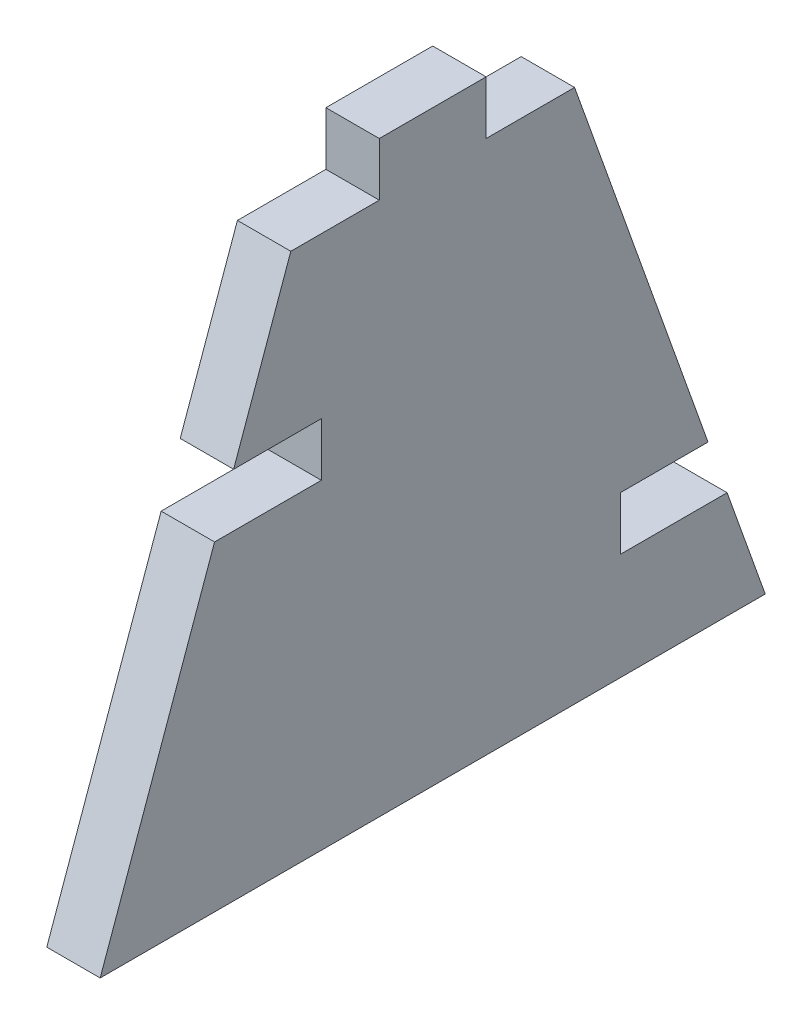
ISO-10303-21;
HEADER;
FILE_DESCRIPTION(('STEP AP214'),'2;1');
FILE_NAME('part.step','',(''),(''),'','','');
FILE_SCHEMA(('AUTOMOTIVE_DESIGN { 1 0 10303 214 1 1 1 1 }'));
ENDSEC;
DATA;
#1=APPLICATION_CONTEXT('core data for automotive mechanical design processes');
#2=APPLICATION_PROTOCOL_DEFINITION('international standard','automotive_design',2000,#1);
#3=PRODUCT_CONTEXT('',#1,'mechanical');
#4=PRODUCT('Part','Part','',(#3));
#5=PRODUCT_RELATED_PRODUCT_CATEGORY('part','',(#4));
#6=PRODUCT_DEFINITION_FORMATION('','',#4);
#7=PRODUCT_DEFINITION_CONTEXT('part definition',#1,'design');
#8=PRODUCT_DEFINITION('design','',#6,#7);
#9=PRODUCT_DEFINITION_SHAPE('','',#8);
#10=(LENGTH_UNIT() NAMED_UNIT(*) SI_UNIT(.MILLI.,.METRE.));
#11=(NAMED_UNIT(*) PLANE_ANGLE_UNIT() SI_UNIT($,.RADIAN.));
#12=(NAMED_UNIT(*) SI_UNIT($,.STERADIAN.) SOLID_ANGLE_UNIT());
#13=UNCERTAINTY_MEASURE_WITH_UNIT(LENGTH_MEASURE(1.E-05),#10,'distance_accuracy_value','');
#14=(GEOMETRIC_REPRESENTATION_CONTEXT(3) GLOBAL_UNCERTAINTY_ASSIGNED_CONTEXT((#13)) GLOBAL_UNIT_ASSIGNED_CONTEXT((#10,
#11,#12)) REPRESENTATION_CONTEXT('',''));
#15=CARTESIAN_POINT('',(0.,0.,0.));
#16=DIRECTION('',(0.,0.,1.));
#17=DIRECTION('',(1.,0.,0.));
#18=AXIS2_PLACEMENT_3D('',#15,#16,#17);
#19=CARTESIAN_POINT('',(254.,0.,2575.20895259704));
#20=DIRECTION('',(0.,-0.336198277299661,-0.941791228638673));
#21=DIRECTION('',(0.,0.941791228638673,-0.336198277299661));
#22=AXIS2_PLACEMENT_3D('',#19,#20,#21);
#23=PLANE('',#22);
#24=DIRECTION('',(0.,-0.941791228638672,0.336198277299661));
#25=VECTOR('',#24,1.);
#26=CARTESIAN_POINT('',(0.,0.,2575.20895259704));
#27=LINE('',#26,#25);
#28=CARTESIAN_POINT('',(0.,1524.,2031.17524425035));
#29=VERTEX_POINT('',#28);
#30=CARTESIAN_POINT('',(0.,0.,2575.20895259704));
#31=VERTEX_POINT('',#30);
#32=EDGE_CURVE('E177',#29,#31,#27,.T.);
#33=ORIENTED_EDGE('',*,*,#32,.T.);
#34=DIRECTION('',(-1.,0.,0.));
#35=VECTOR('',#34,1.);
#36=CARTESIAN_POINT('',(254.,0.,2575.20895259704));
#37=LINE('',#36,#35);
#38=CARTESIAN_POINT('',(254.,0.,2575.20895259704));
#39=VERTEX_POINT('',#38);
#40=EDGE_CURVE('E11',#39,#31,#37,.T.);
#41=ORIENTED_EDGE('',*,*,#40,.F.);
#42=DIRECTION('',(0.,-0.941791228638672,0.336198277299661));
#43=VECTOR('',#42,1.);
#44=CARTESIAN_POINT('',(254.,0.,2575.20895259704));
#45=LINE('',#44,#43);
#46=CARTESIAN_POINT('',(254.,1524.,2031.17524425035));
#47=VERTEX_POINT('',#46);
#48=EDGE_CURVE('E207',#47,#39,#45,.T.);
#49=ORIENTED_EDGE('',*,*,#48,.F.);
#50=DIRECTION('',(-1.,0.,0.));
#51=VECTOR('',#50,1.);
#52=CARTESIAN_POINT('',(254.,1524.,2031.17524425035));
#53=LINE('',#52,#51);
#54=EDGE_CURVE('E173',#47,#29,#53,.T.);
#55=ORIENTED_EDGE('',*,*,#54,.T.);
#56=EDGE_LOOP('',(#33,#41,#49,#55));
#57=FACE_BOUND('',#56,.T.);
#58=ADVANCED_FACE('F33',(#57),#23,.F.);
#59=CARTESIAN_POINT('',(254.,1.77635683940025E-12,-587.895207133644));
#60=DIRECTION('',(0.,1.,0.));
#61=DIRECTION('',(0.,0.,1.));
#62=AXIS2_PLACEMENT_3D('',#59,#60,#61);
#63=PLANE('',#62);
#64=DIRECTION('',(0.,0.,-1.));
#65=VECTOR('',#64,1.);
#66=CARTESIAN_POINT('',(0.,1.77635683940025E-12,-587.895207133644));
#67=LINE('',#66,#65);
#68=CARTESIAN_POINT('',(0.,1.77635683940025E-12,-587.895207133644));
#69=VERTEX_POINT('',#68);
#70=EDGE_CURVE('E180',#31,#69,#67,.T.);
#71=ORIENTED_EDGE('',*,*,#70,.T.);
#72=DIRECTION('',(-1.,0.,0.));
#73=VECTOR('',#72,1.);
#74=CARTESIAN_POINT('',(254.,1.77635683940025E-12,-587.895207133644));
#75=LINE('',#74,#73);
#76=CARTESIAN_POINT('',(254.,1.77635683940025E-12,-587.895207133644));
#77=VERTEX_POINT('',#76);
#78=EDGE_CURVE('E41',#77,#69,#75,.T.);
#79=ORIENTED_EDGE('',*,*,#78,.F.);
#80=DIRECTION('',(0.,0.,-1.));
#81=VECTOR('',#80,1.);
#82=CARTESIAN_POINT('',(254.,1.77635683940025E-12,-587.895207133644));
#83=LINE('',#82,#81);
#84=EDGE_CURVE('E116',#39,#77,#83,.T.);
#85=ORIENTED_EDGE('',*,*,#84,.F.);
#86=ORIENTED_EDGE('',*,*,#40,.T.);
#87=EDGE_LOOP('',(#71,#79,#85,#86));
#88=FACE_BOUND('',#87,.T.);
#89=ADVANCED_FACE('F305',(#88),#63,.F.);
#90=CARTESIAN_POINT('',(254.,1.77635683940025E-12,-587.895207133644));
#91=DIRECTION('',(0.,-0.336198277299661,0.941791228638673));
#92=DIRECTION('',(0.,-0.941791228638672,-0.336198277299661));
#93=AXIS2_PLACEMENT_3D('',#90,#91,#92);
#94=PLANE('',#93);
#95=DIRECTION('',(0.,0.941791228638673,0.336198277299661));
#96=VECTOR('',#95,1.);
#97=CARTESIAN_POINT('',(0.,1.77635683940025E-12,-587.895207133644));
#98=LINE('',#97,#96);
#99=CARTESIAN_POINT('',(0.,508.,-406.550637684748));
#100=VERTEX_POINT('',#99);
#101=EDGE_CURVE('E182',#69,#100,#98,.T.);
#102=ORIENTED_EDGE('',*,*,#101,.T.);
#103=DIRECTION('',(-1.,0.,0.));
#104=VECTOR('',#103,1.);
#105=CARTESIAN_POINT('',(254.,508.,-406.550637684748));
#106=LINE('',#105,#104);
#107=CARTESIAN_POINT('',(254.,508.,-406.550637684748));
#108=VERTEX_POINT('',#107);
#109=EDGE_CURVE('E238',#108,#100,#106,.T.);
#110=ORIENTED_EDGE('',*,*,#109,.F.);
#111=DIRECTION('',(0.,0.941791228638673,0.336198277299661));
#112=VECTOR('',#111,1.);
#113=CARTESIAN_POINT('',(254.,1.77635683940025E-12,-587.895207133644));
#114=LINE('',#113,#112);
#115=EDGE_CURVE('E246',#77,#108,#114,.T.);
#116=ORIENTED_EDGE('',*,*,#115,.F.);
#117=ORIENTED_EDGE('',*,*,#78,.T.);
#118=EDGE_LOOP('',(#102,#110,#116,#117));
#119=FACE_BOUND('',#118,.T.);
#120=ADVANCED_FACE('F244',(#119),#94,.F.);
#121=CARTESIAN_POINT('',(254.,508.,101.449362315252));
#122=DIRECTION('',(0.,-1.,0.));
#123=DIRECTION('',(0.,0.,-1.));
#124=AXIS2_PLACEMENT_3D('',#121,#122,#123);
#125=PLANE('',#124);
#126=DIRECTION('',(0.,0.,1.));
#127=VECTOR('',#126,1.);
#128=CARTESIAN_POINT('',(0.,508.,101.449362315252));
#129=LINE('',#128,#127);
#130=CARTESIAN_POINT('',(0.,508.,101.449362315252));
#131=VERTEX_POINT('',#130);
#132=EDGE_CURVE('E184',#100,#131,#129,.T.);
#133=ORIENTED_EDGE('',*,*,#132,.T.);
#134=DIRECTION('',(-1.,0.,0.));
#135=VECTOR('',#134,1.);
#136=CARTESIAN_POINT('',(254.,508.,101.449362315252));
#137=LINE('',#136,#135);
#138=CARTESIAN_POINT('',(254.,508.,101.449362315252));
#139=VERTEX_POINT('',#138);
#140=EDGE_CURVE('E235',#139,#131,#137,.T.);
#141=ORIENTED_EDGE('',*,*,#140,.F.);
#142=DIRECTION('',(0.,0.,1.));
#143=VECTOR('',#142,1.);
#144=CARTESIAN_POINT('',(254.,508.,101.449362315252));
#145=LINE('',#144,#143);
#146=EDGE_CURVE('E264',#108,#139,#145,.T.);
#147=ORIENTED_EDGE('',*,*,#146,.F.);
#148=ORIENTED_EDGE('',*,*,#109,.T.);
#149=EDGE_LOOP('',(#133,#141,#147,#148));
#150=FACE_BOUND('',#149,.T.);
#151=ADVANCED_FACE('F255',(#150),#125,.F.);
#152=CARTESIAN_POINT('',(254.,762.,101.449362315252));
#153=DIRECTION('',(0.,0.,1.));
#154=DIRECTION('',(0.,-1.,0.));
#155=AXIS2_PLACEMENT_3D('',#152,#153,#154);
#156=PLANE('',#155);
#157=DIRECTION('',(0.,1.,0.));
#158=VECTOR('',#157,1.);
#159=CARTESIAN_POINT('',(0.,762.,101.449362315252));
#160=LINE('',#159,#158);
#161=CARTESIAN_POINT('',(0.,762.,101.449362315252));
#162=VERTEX_POINT('',#161);
#163=EDGE_CURVE('E186',#131,#162,#160,.T.);
#164=ORIENTED_EDGE('',*,*,#163,.T.);
#165=DIRECTION('',(-1.,0.,0.));
#166=VECTOR('',#165,1.);
#167=CARTESIAN_POINT('',(254.,762.,101.449362315252));
#168=LINE('',#167,#166);
#169=CARTESIAN_POINT('',(254.,762.,101.449362315252));
#170=VERTEX_POINT('',#169);
#171=EDGE_CURVE('E232',#170,#162,#168,.T.);
#172=ORIENTED_EDGE('',*,*,#171,.F.);
#173=DIRECTION('',(0.,1.,0.));
#174=VECTOR('',#173,1.);
#175=CARTESIAN_POINT('',(254.,762.,101.449362315252));
#176=LINE('',#175,#174);
#177=EDGE_CURVE('E261',#139,#170,#176,.T.);
#178=ORIENTED_EDGE('',*,*,#177,.F.);
#179=ORIENTED_EDGE('',*,*,#140,.T.);
#180=EDGE_LOOP('',(#164,#172,#178,#179));
#181=FACE_BOUND('',#180,.T.);
#182=ADVANCED_FACE('F259',(#181),#156,.F.);
#183=CARTESIAN_POINT('',(254.,762.,-315.878352960299));
#184=DIRECTION('',(0.,1.,0.));
#185=DIRECTION('',(0.,0.,1.));
#186=AXIS2_PLACEMENT_3D('',#183,#184,#185);
#187=PLANE('',#186);
#188=DIRECTION('',(0.,0.,-1.));
#189=VECTOR('',#188,1.);
#190=CARTESIAN_POINT('',(0.,762.,-315.878352960299));
#191=LINE('',#190,#189);
#192=CARTESIAN_POINT('',(0.,762.,-315.878352960299));
#193=VERTEX_POINT('',#192);
#194=EDGE_CURVE('E188',#162,#193,#191,.T.);
#195=ORIENTED_EDGE('',*,*,#194,.T.);
#196=DIRECTION('',(-1.,0.,0.));
#197=VECTOR('',#196,1.);
#198=CARTESIAN_POINT('',(254.,762.,-315.878352960299));
#199=LINE('',#198,#197);
#200=CARTESIAN_POINT('',(254.,762.,-315.878352960299));
#201=VERTEX_POINT('',#200);
#202=EDGE_CURVE('E229',#201,#193,#199,.T.);
#203=ORIENTED_EDGE('',*,*,#202,.F.);
#204=DIRECTION('',(0.,0.,-1.));
#205=VECTOR('',#204,1.);
#206=CARTESIAN_POINT('',(254.,762.,-315.878352960299));
#207=LINE('',#206,#205);
#208=EDGE_CURVE('E263',#170,#201,#207,.T.);
#209=ORIENTED_EDGE('',*,*,#208,.F.);
#210=ORIENTED_EDGE('',*,*,#171,.T.);
#211=EDGE_LOOP('',(#195,#203,#209,#210));
#212=FACE_BOUND('',#211,.T.);
#213=ADVANCED_FACE('F318',(#212),#187,.F.);
#214=CARTESIAN_POINT('',(254.,762.,-315.878352960299));
#215=DIRECTION('',(0.,-0.336198277299661,0.941791228638672));
#216=DIRECTION('',(0.,-0.941791228638672,-0.336198277299661));
#217=AXIS2_PLACEMENT_3D('',#214,#215,#216);
#218=PLANE('',#217);
#219=DIRECTION('',(0.,0.941791228638672,0.336198277299661));
#220=VECTOR('',#219,1.);
#221=CARTESIAN_POINT('',(0.,762.,-315.878352960299));
#222=LINE('',#221,#220);
#223=CARTESIAN_POINT('',(0.,2540.,318.827640110841));
#224=VERTEX_POINT('',#223);
#225=EDGE_CURVE('E190',#193,#224,#222,.T.);
#226=ORIENTED_EDGE('',*,*,#225,.T.);
#227=DIRECTION('',(-1.,0.,0.));
#228=VECTOR('',#227,1.);
#229=CARTESIAN_POINT('',(254.,2540.,318.827640110841));
#230=LINE('',#229,#228);
#231=CARTESIAN_POINT('',(254.,2540.,318.827640110841));
#232=VERTEX_POINT('',#231);
#233=EDGE_CURVE('E226',#232,#224,#230,.T.);
#234=ORIENTED_EDGE('',*,*,#233,.F.);
#235=DIRECTION('',(0.,0.941791228638672,0.336198277299661));
#236=VECTOR('',#235,1.);
#237=CARTESIAN_POINT('',(254.,762.,-315.878352960299));
#238=LINE('',#237,#236);
#239=EDGE_CURVE('E266',#201,#232,#238,.T.);
#240=ORIENTED_EDGE('',*,*,#239,.F.);
#241=ORIENTED_EDGE('',*,*,#202,.T.);
#242=EDGE_LOOP('',(#226,#234,#240,#241));
#243=FACE_BOUND('',#242,.T.);
#244=ADVANCED_FACE('F321',(#243),#218,.F.);
#245=CARTESIAN_POINT('',(254.,2540.,318.827640110841));
#246=DIRECTION('',(0.,-1.,0.));
#247=DIRECTION('',(0.,0.,-1.));
#248=AXIS2_PLACEMENT_3D('',#245,#246,#247);
#249=PLANE('',#248);
#250=DIRECTION('',(0.,0.,1.));
#251=VECTOR('',#250,1.);
#252=CARTESIAN_POINT('',(0.,2540.,318.827640110841));
#253=LINE('',#252,#251);
#254=CARTESIAN_POINT('',(0.,2540.,739.656872731696));
#255=VERTEX_POINT('',#254);
#256=EDGE_CURVE('E192',#224,#255,#253,.T.);
#257=ORIENTED_EDGE('',*,*,#256,.T.);
#258=DIRECTION('',(-1.,0.,0.));
#259=VECTOR('',#258,1.);
#260=CARTESIAN_POINT('',(254.,2540.,739.656872731696));
#261=LINE('',#260,#259);
#262=CARTESIAN_POINT('',(254.,2540.,739.656872731696));
#263=VERTEX_POINT('',#262);
#264=EDGE_CURVE('E223',#263,#255,#261,.T.);
#265=ORIENTED_EDGE('',*,*,#264,.F.);
#266=DIRECTION('',(0.,0.,1.));
#267=VECTOR('',#266,1.);
#268=CARTESIAN_POINT('',(254.,2540.,318.827640110841));
#269=LINE('',#268,#267);
#270=EDGE_CURVE('E272',#232,#263,#269,.T.);
#271=ORIENTED_EDGE('',*,*,#270,.F.);
#272=ORIENTED_EDGE('',*,*,#233,.T.);
#273=EDGE_LOOP('',(#257,#265,#271,#272));
#274=FACE_BOUND('',#273,.T.);
#275=ADVANCED_FACE('F325',(#274),#249,.F.);
#276=CARTESIAN_POINT('',(254.,2540.,739.656872731696));
#277=DIRECTION('',(0.,0.,1.));
#278=DIRECTION('',(1.,0.,0.));
#279=AXIS2_PLACEMENT_3D('',#276,#277,#278);
#280=PLANE('',#279);
#281=DIRECTION('',(0.,1.,0.));
#282=VECTOR('',#281,1.);
#283=CARTESIAN_POINT('',(0.,2540.,739.656872731696));
#284=LINE('',#283,#282);
#285=CARTESIAN_POINT('',(0.,2794.,739.656872731696));
#286=VERTEX_POINT('',#285);
#287=EDGE_CURVE('E194',#255,#286,#284,.T.);
#288=ORIENTED_EDGE('',*,*,#287,.T.);
#289=DIRECTION('',(-1.,0.,0.));
#290=VECTOR('',#289,1.);
#291=CARTESIAN_POINT('',(254.,2794.,739.656872731696));
#292=LINE('',#291,#290);
#293=CARTESIAN_POINT('',(254.,2794.,739.656872731696));
#294=VERTEX_POINT('',#293);
#295=EDGE_CURVE('E220',#294,#286,#292,.T.);
#296=ORIENTED_EDGE('',*,*,#295,.F.);
#297=DIRECTION('',(0.,1.,0.));
#298=VECTOR('',#297,1.);
#299=CARTESIAN_POINT('',(254.,2540.,739.656872731696));
#300=LINE('',#299,#298);
#301=EDGE_CURVE('E274',#263,#294,#300,.T.);
#302=ORIENTED_EDGE('',*,*,#301,.F.);
#303=ORIENTED_EDGE('',*,*,#264,.T.);
#304=EDGE_LOOP('',(#288,#296,#302,#303));
#305=FACE_BOUND('',#304,.T.);
#306=ADVANCED_FACE('F329',(#305),#280,.F.);
#307=CARTESIAN_POINT('',(254.,2794.,1247.6568727317));
#308=DIRECTION('',(0.,-1.,0.));
#309=DIRECTION('',(0.,0.,-1.));
#310=AXIS2_PLACEMENT_3D('',#307,#308,#309);
#311=PLANE('',#310);
#312=DIRECTION('',(0.,0.,1.));
#313=VECTOR('',#312,1.);
#314=CARTESIAN_POINT('',(0.,2794.,1247.6568727317));
#315=LINE('',#314,#313);
#316=CARTESIAN_POINT('',(0.,2794.,1247.6568727317));
#317=VERTEX_POINT('',#316);
#318=EDGE_CURVE('E196',#286,#317,#315,.T.);
#319=ORIENTED_EDGE('',*,*,#318,.T.);
#320=DIRECTION('',(-1.,0.,0.));
#321=VECTOR('',#320,1.);
#322=CARTESIAN_POINT('',(254.,2794.,1247.6568727317));
#323=LINE('',#322,#321);
#324=CARTESIAN_POINT('',(254.,2794.,1247.6568727317));
#325=VERTEX_POINT('',#324);
#326=EDGE_CURVE('E217',#325,#317,#323,.T.);
#327=ORIENTED_EDGE('',*,*,#326,.F.);
#328=DIRECTION('',(0.,0.,1.));
#329=VECTOR('',#328,1.);
#330=CARTESIAN_POINT('',(254.,2794.,1247.6568727317));
#331=LINE('',#330,#329);
#332=EDGE_CURVE('E276',#294,#325,#331,.T.);
#333=ORIENTED_EDGE('',*,*,#332,.F.);
#334=ORIENTED_EDGE('',*,*,#295,.T.);
#335=EDGE_LOOP('',(#319,#327,#333,#334));
#336=FACE_BOUND('',#335,.T.);
#337=ADVANCED_FACE('F333',(#336),#311,.F.);
#338=CARTESIAN_POINT('',(254.,2540.,1247.6568727317));
#339=DIRECTION('',(0.,0.,-1.));
#340=DIRECTION('',(-1.,0.,0.));
#341=AXIS2_PLACEMENT_3D('',#338,#339,#340);
#342=PLANE('',#341);
#343=DIRECTION('',(0.,-1.,0.));
#344=VECTOR('',#343,1.);
#345=CARTESIAN_POINT('',(0.,2540.,1247.6568727317));
#346=LINE('',#345,#344);
#347=CARTESIAN_POINT('',(0.,2540.,1247.6568727317));
#348=VERTEX_POINT('',#347);
#349=EDGE_CURVE('E198',#317,#348,#346,.T.);
#350=ORIENTED_EDGE('',*,*,#349,.T.);
#351=DIRECTION('',(-1.,0.,0.));
#352=VECTOR('',#351,1.);
#353=CARTESIAN_POINT('',(254.,2540.,1247.6568727317));
#354=LINE('',#353,#352);
#355=CARTESIAN_POINT('',(254.,2540.,1247.6568727317));
#356=VERTEX_POINT('',#355);
#357=EDGE_CURVE('E214',#356,#348,#354,.T.);
#358=ORIENTED_EDGE('',*,*,#357,.F.);
#359=DIRECTION('',(0.,-1.,0.));
#360=VECTOR('',#359,1.);
#361=CARTESIAN_POINT('',(254.,2540.,1247.6568727317));
#362=LINE('',#361,#360);
#363=EDGE_CURVE('E278',#325,#356,#362,.T.);
#364=ORIENTED_EDGE('',*,*,#363,.F.);
#365=ORIENTED_EDGE('',*,*,#326,.T.);
#366=EDGE_LOOP('',(#350,#358,#364,#365));
#367=FACE_BOUND('',#366,.T.);
#368=ADVANCED_FACE('F337',(#367),#342,.F.);
#369=CARTESIAN_POINT('',(254.,2540.,1668.48610535255));
#370=DIRECTION('',(0.,-1.,0.));
#371=DIRECTION('',(0.,0.,-1.));
#372=AXIS2_PLACEMENT_3D('',#369,#370,#371);
#373=PLANE('',#372);
#374=DIRECTION('',(0.,0.,1.));
#375=VECTOR('',#374,1.);
#376=CARTESIAN_POINT('',(0.,2540.,1668.48610535255));
#377=LINE('',#376,#375);
#378=CARTESIAN_POINT('',(0.,2540.,1668.48610535255));
#379=VERTEX_POINT('',#378);
#380=EDGE_CURVE('E200',#348,#379,#377,.T.);
#381=ORIENTED_EDGE('',*,*,#380,.T.);
#382=DIRECTION('',(-1.,0.,0.));
#383=VECTOR('',#382,1.);
#384=CARTESIAN_POINT('',(254.,2540.,1668.48610535255));
#385=LINE('',#384,#383);
#386=CARTESIAN_POINT('',(254.,2540.,1668.48610535255));
#387=VERTEX_POINT('',#386);
#388=EDGE_CURVE('E211',#387,#379,#385,.T.);
#389=ORIENTED_EDGE('',*,*,#388,.F.);
#390=DIRECTION('',(0.,0.,1.));
#391=VECTOR('',#390,1.);
#392=CARTESIAN_POINT('',(254.,2540.,1668.48610535255));
#393=LINE('',#392,#391);
#394=EDGE_CURVE('E280',#356,#387,#393,.T.);
#395=ORIENTED_EDGE('',*,*,#394,.F.);
#396=ORIENTED_EDGE('',*,*,#357,.T.);
#397=EDGE_LOOP('',(#381,#389,#395,#396));
#398=FACE_BOUND('',#397,.T.);
#399=ADVANCED_FACE('F286',(#398),#373,.F.);
#400=CARTESIAN_POINT('',(254.,1778.,1940.5029595259));
#401=DIRECTION('',(0.,-0.336198277299661,-0.941791228638672));
#402=DIRECTION('',(0.,0.941791228638672,-0.336198277299661));
#403=AXIS2_PLACEMENT_3D('',#400,#401,#402);
#404=PLANE('',#403);
#405=DIRECTION('',(0.,-0.941791228638672,0.336198277299661));
#406=VECTOR('',#405,1.);
#407=CARTESIAN_POINT('',(0.,1778.,1940.5029595259));
#408=LINE('',#407,#406);
#409=CARTESIAN_POINT('',(0.,1778.,1940.5029595259));
#410=VERTEX_POINT('',#409);
#411=EDGE_CURVE('E202',#379,#410,#408,.T.);
#412=ORIENTED_EDGE('',*,*,#411,.T.);
#413=DIRECTION('',(-1.,0.,0.));
#414=VECTOR('',#413,1.);
#415=CARTESIAN_POINT('',(254.,1778.,1940.5029595259));
#416=LINE('',#415,#414);
#417=CARTESIAN_POINT('',(254.,1778.,1940.5029595259));
#418=VERTEX_POINT('',#417);
#419=EDGE_CURVE('E168',#418,#410,#416,.T.);
#420=ORIENTED_EDGE('',*,*,#419,.F.);
#421=DIRECTION('',(0.,-0.941791228638672,0.336198277299661));
#422=VECTOR('',#421,1.);
#423=CARTESIAN_POINT('',(254.,1778.,1940.5029595259));
#424=LINE('',#423,#422);
#425=EDGE_CURVE('E159',#387,#418,#424,.T.);
#426=ORIENTED_EDGE('',*,*,#425,.F.);
#427=ORIENTED_EDGE('',*,*,#388,.T.);
#428=EDGE_LOOP('',(#412,#420,#426,#427));
#429=FACE_BOUND('',#428,.T.);
#430=ADVANCED_FACE('F290',(#429),#404,.F.);
#431=CARTESIAN_POINT('',(254.,1778.,1523.17524425035));
#432=DIRECTION('',(0.,1.,0.));
#433=DIRECTION('',(0.,0.,1.));
#434=AXIS2_PLACEMENT_3D('',#431,#432,#433);
#435=PLANE('',#434);
#436=DIRECTION('',(0.,0.,-1.));
#437=VECTOR('',#436,1.);
#438=CARTESIAN_POINT('',(0.,1778.,1523.17524425035));
#439=LINE('',#438,#437);
#440=CARTESIAN_POINT('',(0.,1778.,1523.17524425035));
#441=VERTEX_POINT('',#440);
#442=EDGE_CURVE('E167',#410,#441,#439,.T.);
#443=ORIENTED_EDGE('',*,*,#442,.T.);
#444=DIRECTION('',(-1.,0.,0.));
#445=VECTOR('',#444,1.);
#446=CARTESIAN_POINT('',(254.,1778.,1523.17524425035));
#447=LINE('',#446,#445);
#448=CARTESIAN_POINT('',(254.,1778.,1523.17524425035));
#449=VERTEX_POINT('',#448);
#450=EDGE_CURVE('E164',#449,#441,#447,.T.);
#451=ORIENTED_EDGE('',*,*,#450,.F.);
#452=DIRECTION('',(0.,0.,-1.));
#453=VECTOR('',#452,1.);
#454=CARTESIAN_POINT('',(254.,1778.,1523.17524425035));
#455=LINE('',#454,#453);
#456=EDGE_CURVE('E153',#418,#449,#455,.T.);
#457=ORIENTED_EDGE('',*,*,#456,.F.);
#458=ORIENTED_EDGE('',*,*,#419,.T.);
#459=EDGE_LOOP('',(#443,#451,#457,#458));
#460=FACE_BOUND('',#459,.T.);
#461=ADVANCED_FACE('F165',(#460),#435,.F.);
#462=CARTESIAN_POINT('',(254.,1524.,1523.17524425035));
#463=DIRECTION('',(0.,0.,-1.));
#464=DIRECTION('',(-1.,0.,0.));
#465=AXIS2_PLACEMENT_3D('',#462,#463,#464);
#466=PLANE('',#465);
#467=DIRECTION('',(0.,-1.,0.));
#468=VECTOR('',#467,1.);
#469=CARTESIAN_POINT('',(0.,1524.,1523.17524425035));
#470=LINE('',#469,#468);
#471=CARTESIAN_POINT('',(0.,1524.,1523.17524425035));
#472=VERTEX_POINT('',#471);
#473=EDGE_CURVE('E102',#441,#472,#470,.T.);
#474=ORIENTED_EDGE('',*,*,#473,.T.);
#475=DIRECTION('',(-1.,0.,0.));
#476=VECTOR('',#475,1.);
#477=CARTESIAN_POINT('',(254.,1524.,1523.17524425035));
#478=LINE('',#477,#476);
#479=CARTESIAN_POINT('',(254.,1524.,1523.17524425035));
#480=VERTEX_POINT('',#479);
#481=EDGE_CURVE('E169',#480,#472,#478,.T.);
#482=ORIENTED_EDGE('',*,*,#481,.F.);
#483=DIRECTION('',(0.,-1.,0.));
#484=VECTOR('',#483,1.);
#485=CARTESIAN_POINT('',(254.,1524.,1523.17524425035));
#486=LINE('',#485,#484);
#487=EDGE_CURVE('E157',#449,#480,#486,.T.);
#488=ORIENTED_EDGE('',*,*,#487,.F.);
#489=ORIENTED_EDGE('',*,*,#450,.T.);
#490=EDGE_LOOP('',(#474,#482,#488,#489));
#491=FACE_BOUND('',#490,.T.);
#492=ADVANCED_FACE('F171',(#491),#466,.F.);
#493=CARTESIAN_POINT('',(254.,1524.,2031.17524425035));
#494=DIRECTION('',(0.,-1.,0.));
#495=DIRECTION('',(0.,0.,-1.));
#496=AXIS2_PLACEMENT_3D('',#493,#494,#495);
#497=PLANE('',#496);
#498=DIRECTION('',(0.,0.,1.));
#499=VECTOR('',#498,1.);
#500=CARTESIAN_POINT('',(0.,1524.,2031.17524425035));
#501=LINE('',#500,#499);
#502=EDGE_CURVE('E108',#472,#29,#501,.T.);
#503=ORIENTED_EDGE('',*,*,#502,.T.);
#504=ORIENTED_EDGE('',*,*,#54,.F.);
#505=DIRECTION('',(0.,0.,1.));
#506=VECTOR('',#505,1.);
#507=CARTESIAN_POINT('',(254.,1524.,2031.17524425035));
#508=LINE('',#507,#506);
#509=EDGE_CURVE('E49',#480,#47,#508,.T.);
#510=ORIENTED_EDGE('',*,*,#509,.F.);
#511=ORIENTED_EDGE('',*,*,#481,.T.);
#512=EDGE_LOOP('',(#503,#504,#510,#511));
#513=FACE_BOUND('',#512,.T.);
#514=ADVANCED_FACE('F294',(#513),#497,.F.);
#515=CARTESIAN_POINT('',(254.,0.,0.));
#516=DIRECTION('',(-1.,0.,0.));
#517=DIRECTION('',(0.,0.,1.));
#518=AXIS2_PLACEMENT_3D('',#515,#516,#517);
#519=PLANE('',#518);
#520=ORIENTED_EDGE('',*,*,#48,.T.);
#521=ORIENTED_EDGE('',*,*,#84,.T.);
#522=ORIENTED_EDGE('',*,*,#115,.T.);
#523=ORIENTED_EDGE('',*,*,#146,.T.);
#524=ORIENTED_EDGE('',*,*,#177,.T.);
#525=ORIENTED_EDGE('',*,*,#208,.T.);
#526=ORIENTED_EDGE('',*,*,#239,.T.);
#527=ORIENTED_EDGE('',*,*,#270,.T.);
#528=ORIENTED_EDGE('',*,*,#301,.T.);
#529=ORIENTED_EDGE('',*,*,#332,.T.);
#530=ORIENTED_EDGE('',*,*,#363,.T.);
#531=ORIENTED_EDGE('',*,*,#394,.T.);
#532=ORIENTED_EDGE('',*,*,#425,.T.);
#533=ORIENTED_EDGE('',*,*,#456,.T.);
#534=ORIENTED_EDGE('',*,*,#487,.T.);
#535=ORIENTED_EDGE('',*,*,#509,.T.);
#536=EDGE_LOOP('',(#520,#521,#522,#523,#524,#525,#526,#527,#528,#529,#530,#531,#532,#533,#534,#535));
#537=FACE_BOUND('',#536,.T.);
#538=ADVANCED_FACE('F155',(#537),#519,.F.);
#539=CARTESIAN_POINT('',(0.,0.,0.));
#540=DIRECTION('',(-1.,0.,0.));
#541=DIRECTION('',(0.,0.,1.));
#542=AXIS2_PLACEMENT_3D('',#539,#540,#541);
#543=PLANE('',#542);
#544=ORIENTED_EDGE('',*,*,#32,.F.);
#545=ORIENTED_EDGE('',*,*,#502,.F.);
#546=ORIENTED_EDGE('',*,*,#473,.F.);
#547=ORIENTED_EDGE('',*,*,#442,.F.);
#548=ORIENTED_EDGE('',*,*,#411,.F.);
#549=ORIENTED_EDGE('',*,*,#380,.F.);
#550=ORIENTED_EDGE('',*,*,#349,.F.);
#551=ORIENTED_EDGE('',*,*,#318,.F.);
#552=ORIENTED_EDGE('',*,*,#287,.F.);
#553=ORIENTED_EDGE('',*,*,#256,.F.);
#554=ORIENTED_EDGE('',*,*,#225,.F.);
#555=ORIENTED_EDGE('',*,*,#194,.F.);
#556=ORIENTED_EDGE('',*,*,#163,.F.);
#557=ORIENTED_EDGE('',*,*,#132,.F.);
#558=ORIENTED_EDGE('',*,*,#101,.F.);
#559=ORIENTED_EDGE('',*,*,#70,.F.);
#560=EDGE_LOOP('',(#544,#545,#546,#547,#548,#549,#550,#551,#552,#553,#554,#555,#556,#557,#558,#559));
#561=FACE_BOUND('',#560,.T.);
#562=ADVANCED_FACE('F250',(#561),#543,.T.);
#563=CLOSED_SHELL('',(#58,#89,#120,#151,#182,#213,#244,#275,#306,#337,#368,#399,#430,#461,#492,
#514,#538,#562));
#564=MANIFOLD_SOLID_BREP('B2',#563);
#565=ADVANCED_BREP_SHAPE_REPRESENTATION('',(#18,#564),#14);
#566=SHAPE_DEFINITION_REPRESENTATION(#9,#565);
ENDSEC;
END-ISO-10303-21;
